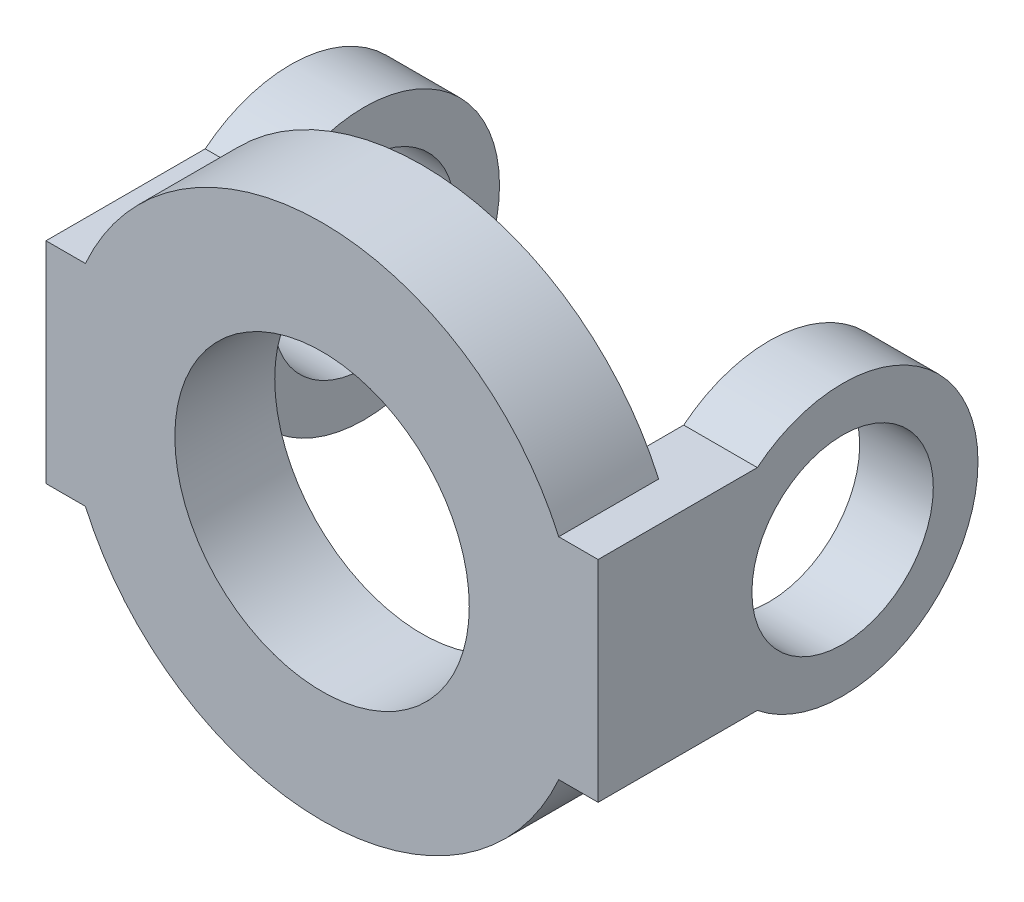
ISO-10303-21;
HEADER;
FILE_DESCRIPTION(('STEP AP214'),'2;1');
FILE_NAME('part.step','',(''),(''),'','','');
FILE_SCHEMA(('AUTOMOTIVE_DESIGN { 1 0 10303 214 1 1 1 1 }'));
ENDSEC;
DATA;
#1=APPLICATION_CONTEXT('core data for automotive mechanical design processes');
#2=APPLICATION_PROTOCOL_DEFINITION('international standard','automotive_design',2000,#1);
#3=PRODUCT_CONTEXT('',#1,'mechanical');
#4=PRODUCT('Part','Part','',(#3));
#5=PRODUCT_RELATED_PRODUCT_CATEGORY('part','',(#4));
#6=PRODUCT_DEFINITION_FORMATION('','',#4);
#7=PRODUCT_DEFINITION_CONTEXT('part definition',#1,'design');
#8=PRODUCT_DEFINITION('design','',#6,#7);
#9=PRODUCT_DEFINITION_SHAPE('','',#8);
#10=(LENGTH_UNIT() NAMED_UNIT(*) SI_UNIT(.MILLI.,.METRE.));
#11=(NAMED_UNIT(*) PLANE_ANGLE_UNIT() SI_UNIT($,.RADIAN.));
#12=(NAMED_UNIT(*) SI_UNIT($,.STERADIAN.) SOLID_ANGLE_UNIT());
#13=UNCERTAINTY_MEASURE_WITH_UNIT(LENGTH_MEASURE(1.E-05),#10,'distance_accuracy_value','');
#14=(GEOMETRIC_REPRESENTATION_CONTEXT(3) GLOBAL_UNCERTAINTY_ASSIGNED_CONTEXT((#13)) GLOBAL_UNIT_ASSIGNED_CONTEXT((#10,
#11,#12)) REPRESENTATION_CONTEXT('',''));
#15=CARTESIAN_POINT('',(0.,0.,0.));
#16=DIRECTION('',(0.,0.,1.));
#17=DIRECTION('',(1.,0.,0.));
#18=AXIS2_PLACEMENT_3D('',#15,#16,#17);
#19=CARTESIAN_POINT('',(0.,0.,0.));
#20=DIRECTION('',(0.,0.,1.));
#21=DIRECTION('',(1.,0.,0.));
#22=AXIS2_PLACEMENT_3D('',#19,#20,#21);
#23=PLANE('',#22);
#24=CARTESIAN_POINT('',(0.,0.,0.));
#25=DIRECTION('',(0.,0.,1.));
#26=DIRECTION('',(1.,0.,0.));
#27=AXIS2_PLACEMENT_3D('',#24,#25,#26);
#28=CIRCLE('',#27,56.);
#29=CARTESIAN_POINT('',(56.,0.,0.));
#30=VERTEX_POINT('',#29);
#31=EDGE_CURVE('E180',#30,#30,#28,.T.);
#32=ORIENTED_EDGE('',*,*,#31,.T.);
#33=EDGE_LOOP('',(#32));
#34=FACE_BOUND('',#33,.T.);
#35=DIRECTION('',(1.,0.,0.));
#36=VECTOR('',#35,1.);
#37=CARTESIAN_POINT('',(77.,-40.,0.));
#38=LINE('',#37,#36);
#39=CARTESIAN_POINT('',(77.,-40.,0.));
#40=VERTEX_POINT('',#39);
#41=CARTESIAN_POINT('',(90.012499132065,-40.,0.));
#42=VERTEX_POINT('',#41);
#43=EDGE_CURVE('E159',#40,#42,#38,.T.);
#44=ORIENTED_EDGE('',*,*,#43,.T.);
#45=CARTESIAN_POINT('',(0.,0.,0.));
#46=DIRECTION('',(0.,0.,1.));
#47=DIRECTION('',(1.,0.,0.));
#48=AXIS2_PLACEMENT_3D('',#45,#46,#47);
#49=CIRCLE('',#48,98.5);
#50=CARTESIAN_POINT('',(-90.012499132065,-40.,0.));
#51=VERTEX_POINT('',#50);
#52=EDGE_CURVE('E196',#51,#42,#49,.T.);
#53=ORIENTED_EDGE('',*,*,#52,.F.);
#54=DIRECTION('',(-1.,0.,0.));
#55=VECTOR('',#54,1.);
#56=CARTESIAN_POINT('',(-77.,-40.,0.));
#57=LINE('',#56,#55);
#58=CARTESIAN_POINT('',(-77.,-40.,0.));
#59=VERTEX_POINT('',#58);
#60=EDGE_CURVE('E183',#59,#51,#57,.T.);
#61=ORIENTED_EDGE('',*,*,#60,.F.);
#62=DIRECTION('',(0.,1.,0.));
#63=VECTOR('',#62,1.);
#64=CARTESIAN_POINT('',(-77.,-40.,0.));
#65=LINE('',#64,#63);
#66=CARTESIAN_POINT('',(-77.,40.,0.));
#67=VERTEX_POINT('',#66);
#68=EDGE_CURVE('E168',#59,#67,#65,.T.);
#69=ORIENTED_EDGE('',*,*,#68,.T.);
#70=DIRECTION('',(-1.,0.,0.));
#71=VECTOR('',#70,1.);
#72=CARTESIAN_POINT('',(-77.,40.,0.));
#73=LINE('',#72,#71);
#74=CARTESIAN_POINT('',(-90.012499132065,40.,0.));
#75=VERTEX_POINT('',#74);
#76=EDGE_CURVE('E181',#67,#75,#73,.T.);
#77=ORIENTED_EDGE('',*,*,#76,.T.);
#78=CARTESIAN_POINT('',(0.,0.,0.));
#79=DIRECTION('',(0.,0.,1.));
#80=DIRECTION('',(1.,0.,0.));
#81=AXIS2_PLACEMENT_3D('',#78,#79,#80);
#82=CIRCLE('',#81,98.5);
#83=CARTESIAN_POINT('',(90.012499132065,40.,0.));
#84=VERTEX_POINT('',#83);
#85=EDGE_CURVE('E190',#84,#75,#82,.T.);
#86=ORIENTED_EDGE('',*,*,#85,.F.);
#87=DIRECTION('',(1.,0.,0.));
#88=VECTOR('',#87,1.);
#89=CARTESIAN_POINT('',(77.,40.,0.));
#90=LINE('',#89,#88);
#91=CARTESIAN_POINT('',(77.,40.,0.));
#92=VERTEX_POINT('',#91);
#93=EDGE_CURVE('E142',#92,#84,#90,.T.);
#94=ORIENTED_EDGE('',*,*,#93,.F.);
#95=DIRECTION('',(0.,1.,0.));
#96=VECTOR('',#95,1.);
#97=CARTESIAN_POINT('',(77.,-40.,0.));
#98=LINE('',#97,#96);
#99=EDGE_CURVE('E131',#40,#92,#98,.T.);
#100=ORIENTED_EDGE('',*,*,#99,.F.);
#101=EDGE_LOOP('',(#44,#53,#61,#69,#77,#86,#94,#100));
#102=FACE_BOUND('',#101,.T.);
#103=ADVANCED_FACE('F34',(#34,#102),#23,.F.);
#104=CARTESIAN_POINT('',(0.,0.,38.));
#105=DIRECTION('',(0.,0.,1.));
#106=DIRECTION('',(1.,0.,0.));
#107=AXIS2_PLACEMENT_3D('',#104,#105,#106);
#108=PLANE('',#107);
#109=DIRECTION('',(-1.,0.,0.));
#110=VECTOR('',#109,1.);
#111=CARTESIAN_POINT('',(90.012499132065,40.,38.));
#112=LINE('',#111,#110);
#113=CARTESIAN_POINT('',(105.,40.,38.));
#114=VERTEX_POINT('',#113);
#115=CARTESIAN_POINT('',(90.012499132065,40.,38.));
#116=VERTEX_POINT('',#115);
#117=EDGE_CURVE('E193',#114,#116,#112,.T.);
#118=ORIENTED_EDGE('',*,*,#117,.T.);
#119=CARTESIAN_POINT('',(0.,0.,38.));
#120=DIRECTION('',(0.,0.,1.));
#121=DIRECTION('',(1.,0.,0.));
#122=AXIS2_PLACEMENT_3D('',#119,#120,#121);
#123=CIRCLE('',#122,98.5);
#124=CARTESIAN_POINT('',(-90.012499132065,40.,38.));
#125=VERTEX_POINT('',#124);
#126=EDGE_CURVE('E195',#116,#125,#123,.T.);
#127=ORIENTED_EDGE('',*,*,#126,.T.);
#128=DIRECTION('',(-1.,0.,0.));
#129=VECTOR('',#128,1.);
#130=CARTESIAN_POINT('',(-105.,40.,38.));
#131=LINE('',#130,#129);
#132=CARTESIAN_POINT('',(-105.,40.,38.));
#133=VERTEX_POINT('',#132);
#134=EDGE_CURVE('E198',#125,#133,#131,.T.);
#135=ORIENTED_EDGE('',*,*,#134,.T.);
#136=DIRECTION('',(0.,-1.,0.));
#137=VECTOR('',#136,1.);
#138=CARTESIAN_POINT('',(-105.,-40.,38.));
#139=LINE('',#138,#137);
#140=CARTESIAN_POINT('',(-105.,-40.,38.));
#141=VERTEX_POINT('',#140);
#142=EDGE_CURVE('E200',#133,#141,#139,.T.);
#143=ORIENTED_EDGE('',*,*,#142,.T.);
#144=DIRECTION('',(1.,0.,0.));
#145=VECTOR('',#144,1.);
#146=CARTESIAN_POINT('',(-105.,-40.,38.));
#147=LINE('',#146,#145);
#148=CARTESIAN_POINT('',(-90.012499132065,-40.,38.));
#149=VERTEX_POINT('',#148);
#150=EDGE_CURVE('E202',#141,#149,#147,.T.);
#151=ORIENTED_EDGE('',*,*,#150,.T.);
#152=CARTESIAN_POINT('',(0.,0.,38.));
#153=DIRECTION('',(0.,0.,1.));
#154=DIRECTION('',(1.,0.,0.));
#155=AXIS2_PLACEMENT_3D('',#152,#153,#154);
#156=CIRCLE('',#155,98.5);
#157=CARTESIAN_POINT('',(90.012499132065,-40.,38.));
#158=VERTEX_POINT('',#157);
#159=EDGE_CURVE('E204',#149,#158,#156,.T.);
#160=ORIENTED_EDGE('',*,*,#159,.T.);
#161=DIRECTION('',(1.,0.,0.));
#162=VECTOR('',#161,1.);
#163=CARTESIAN_POINT('',(90.012499132065,-40.,38.));
#164=LINE('',#163,#162);
#165=CARTESIAN_POINT('',(105.,-40.,38.));
#166=VERTEX_POINT('',#165);
#167=EDGE_CURVE('E55',#158,#166,#164,.T.);
#168=ORIENTED_EDGE('',*,*,#167,.T.);
#169=DIRECTION('',(0.,1.,0.));
#170=VECTOR('',#169,1.);
#171=CARTESIAN_POINT('',(105.,-40.,38.));
#172=LINE('',#171,#170);
#173=EDGE_CURVE('E50',#166,#114,#172,.T.);
#174=ORIENTED_EDGE('',*,*,#173,.T.);
#175=EDGE_LOOP('',(#118,#127,#135,#143,#151,#160,#168,#174));
#176=FACE_BOUND('',#175,.T.);
#177=CARTESIAN_POINT('',(0.,0.,38.));
#178=DIRECTION('',(0.,0.,1.));
#179=DIRECTION('',(1.,0.,0.));
#180=AXIS2_PLACEMENT_3D('',#177,#178,#179);
#181=CIRCLE('',#180,56.);
#182=CARTESIAN_POINT('',(56.,0.,38.));
#183=VERTEX_POINT('',#182);
#184=EDGE_CURVE('E187',#183,#183,#181,.T.);
#185=ORIENTED_EDGE('',*,*,#184,.F.);
#186=EDGE_LOOP('',(#185));
#187=FACE_BOUND('',#186,.T.);
#188=ADVANCED_FACE('F254',(#176,#187),#108,.T.);
#189=CARTESIAN_POINT('',(90.012499132065,40.,38.));
#190=DIRECTION('',(0.,-1.,0.));
#191=DIRECTION('',(1.,0.,0.));
#192=AXIS2_PLACEMENT_3D('',#189,#190,#191);
#193=PLANE('',#192);
#194=DIRECTION('',(0.,0.,-1.));
#195=VECTOR('',#194,1.);
#196=CARTESIAN_POINT('',(105.,40.,38.));
#197=LINE('',#196,#195);
#198=CARTESIAN_POINT('',(105.,40.,-22.5615968333828));
#199=VERTEX_POINT('',#198);
#200=EDGE_CURVE('E138',#114,#199,#197,.T.);
#201=ORIENTED_EDGE('',*,*,#200,.T.);
#202=DIRECTION('',(1.,0.,0.));
#203=VECTOR('',#202,1.);
#204=CARTESIAN_POINT('',(77.,40.,-22.5615968333828));
#205=LINE('',#204,#203);
#206=CARTESIAN_POINT('',(77.,40.,-22.5615968333828));
#207=VERTEX_POINT('',#206);
#208=EDGE_CURVE('E136',#207,#199,#205,.T.);
#209=ORIENTED_EDGE('',*,*,#208,.F.);
#210=DIRECTION('',(0.,0.,-1.));
#211=VECTOR('',#210,1.);
#212=CARTESIAN_POINT('',(77.,40.,0.));
#213=LINE('',#212,#211);
#214=EDGE_CURVE('E124',#92,#207,#213,.T.);
#215=ORIENTED_EDGE('',*,*,#214,.F.);
#216=ORIENTED_EDGE('',*,*,#93,.T.);
#217=DIRECTION('',(0.,0.,-1.));
#218=VECTOR('',#217,1.);
#219=CARTESIAN_POINT('',(90.012499132065,40.,38.));
#220=LINE('',#219,#218);
#221=EDGE_CURVE('E11',#116,#84,#220,.T.);
#222=ORIENTED_EDGE('',*,*,#221,.F.);
#223=ORIENTED_EDGE('',*,*,#117,.F.);
#224=EDGE_LOOP('',(#201,#209,#215,#216,#222,#223));
#225=FACE_BOUND('',#224,.T.);
#226=ADVANCED_FACE('F36',(#225),#193,.F.);
#227=CARTESIAN_POINT('',(0.,0.,38.));
#228=DIRECTION('',(0.,0.,-1.));
#229=DIRECTION('',(-1.,0.,0.));
#230=AXIS2_PLACEMENT_3D('',#227,#228,#229);
#231=CYLINDRICAL_SURFACE('',#230,98.5);
#232=ORIENTED_EDGE('',*,*,#85,.T.);
#233=DIRECTION('',(0.,0.,-1.));
#234=VECTOR('',#233,1.);
#235=CARTESIAN_POINT('',(-90.012499132065,40.,38.));
#236=LINE('',#235,#234);
#237=EDGE_CURVE('E43',#125,#75,#236,.T.);
#238=ORIENTED_EDGE('',*,*,#237,.F.);
#239=ORIENTED_EDGE('',*,*,#126,.F.);
#240=ORIENTED_EDGE('',*,*,#221,.T.);
#241=EDGE_LOOP('',(#232,#238,#239,#240));
#242=FACE_BOUND('',#241,.T.);
#243=ADVANCED_FACE('F233',(#242),#231,.T.);
#244=CARTESIAN_POINT('',(-105.,40.,38.));
#245=DIRECTION('',(0.,-1.,0.));
#246=DIRECTION('',(0.,0.,-1.));
#247=AXIS2_PLACEMENT_3D('',#244,#245,#246);
#248=PLANE('',#247);
#249=ORIENTED_EDGE('',*,*,#237,.T.);
#250=ORIENTED_EDGE('',*,*,#76,.F.);
#251=DIRECTION('',(0.,0.,-1.));
#252=VECTOR('',#251,1.);
#253=CARTESIAN_POINT('',(-77.,40.,0.));
#254=LINE('',#253,#252);
#255=CARTESIAN_POINT('',(-77.,40.,-22.5615968333828));
#256=VERTEX_POINT('',#255);
#257=EDGE_CURVE('E171',#67,#256,#254,.T.);
#258=ORIENTED_EDGE('',*,*,#257,.T.);
#259=DIRECTION('',(-1.,0.,0.));
#260=VECTOR('',#259,1.);
#261=CARTESIAN_POINT('',(-77.,40.,-22.5615968333828));
#262=LINE('',#261,#260);
#263=CARTESIAN_POINT('',(-105.,40.,-22.5615968333828));
#264=VERTEX_POINT('',#263);
#265=EDGE_CURVE('E177',#256,#264,#262,.T.);
#266=ORIENTED_EDGE('',*,*,#265,.T.);
#267=DIRECTION('',(0.,0.,-1.));
#268=VECTOR('',#267,1.);
#269=CARTESIAN_POINT('',(-105.,40.,38.));
#270=LINE('',#269,#268);
#271=EDGE_CURVE('E223',#133,#264,#270,.T.);
#272=ORIENTED_EDGE('',*,*,#271,.F.);
#273=ORIENTED_EDGE('',*,*,#134,.F.);
#274=EDGE_LOOP('',(#249,#250,#258,#266,#272,#273));
#275=FACE_BOUND('',#274,.T.);
#276=ADVANCED_FACE('F229',(#275),#248,.F.);
#277=CARTESIAN_POINT('',(-105.,-40.,38.));
#278=DIRECTION('',(1.,0.,0.));
#279=DIRECTION('',(0.,0.,-1.));
#280=AXIS2_PLACEMENT_3D('',#277,#278,#279);
#281=PLANE('',#280);
#282=CARTESIAN_POINT('',(-105.,0.,-55.));
#283=DIRECTION('',(-1.,0.,0.));
#284=DIRECTION('',(0.,0.,1.));
#285=AXIS2_PLACEMENT_3D('',#282,#283,#284);
#286=CIRCLE('',#285,34.5);
#287=CARTESIAN_POINT('',(-105.,0.,-20.5));
#288=VERTEX_POINT('',#287);
#289=EDGE_CURVE('E306',#288,#288,#286,.T.);
#290=ORIENTED_EDGE('',*,*,#289,.F.);
#291=EDGE_LOOP('',(#290));
#292=FACE_BOUND('',#291,.T.);
#293=ORIENTED_EDGE('',*,*,#271,.T.);
#294=CARTESIAN_POINT('',(-105.,0.,-55.));
#295=DIRECTION('',(-1.,0.,0.));
#296=DIRECTION('',(0.,0.,1.));
#297=AXIS2_PLACEMENT_3D('',#294,#295,#296);
#298=CIRCLE('',#297,51.5);
#299=CARTESIAN_POINT('',(-105.,-40.,-22.5615968333828));
#300=VERTEX_POINT('',#299);
#301=EDGE_CURVE('E158',#264,#300,#298,.T.);
#302=ORIENTED_EDGE('',*,*,#301,.T.);
#303=DIRECTION('',(0.,0.,-1.));
#304=VECTOR('',#303,1.);
#305=CARTESIAN_POINT('',(-105.,-40.,38.));
#306=LINE('',#305,#304);
#307=EDGE_CURVE('E221',#141,#300,#306,.T.);
#308=ORIENTED_EDGE('',*,*,#307,.F.);
#309=ORIENTED_EDGE('',*,*,#142,.F.);
#310=EDGE_LOOP('',(#293,#302,#308,#309));
#311=FACE_BOUND('',#310,.T.);
#312=ADVANCED_FACE('F252',(#292,#311),#281,.F.);
#313=CARTESIAN_POINT('',(-105.,-40.,38.));
#314=DIRECTION('',(0.,1.,0.));
#315=DIRECTION('',(0.,0.,1.));
#316=AXIS2_PLACEMENT_3D('',#313,#314,#315);
#317=PLANE('',#316);
#318=ORIENTED_EDGE('',*,*,#307,.T.);
#319=DIRECTION('',(-1.,0.,0.));
#320=VECTOR('',#319,1.);
#321=CARTESIAN_POINT('',(-77.,-40.,-22.5615968333828));
#322=LINE('',#321,#320);
#323=CARTESIAN_POINT('',(-77.,-40.,-22.5615968333828));
#324=VERTEX_POINT('',#323);
#325=EDGE_CURVE('E174',#324,#300,#322,.T.);
#326=ORIENTED_EDGE('',*,*,#325,.F.);
#327=DIRECTION('',(0.,0.,1.));
#328=VECTOR('',#327,1.);
#329=CARTESIAN_POINT('',(-77.,-40.,-22.5615968333828));
#330=LINE('',#329,#328);
#331=EDGE_CURVE('E165',#324,#59,#330,.T.);
#332=ORIENTED_EDGE('',*,*,#331,.T.);
#333=ORIENTED_EDGE('',*,*,#60,.T.);
#334=DIRECTION('',(0.,0.,-1.));
#335=VECTOR('',#334,1.);
#336=CARTESIAN_POINT('',(-90.012499132065,-40.,38.));
#337=LINE('',#336,#335);
#338=EDGE_CURVE('E218',#149,#51,#337,.T.);
#339=ORIENTED_EDGE('',*,*,#338,.F.);
#340=ORIENTED_EDGE('',*,*,#150,.F.);
#341=EDGE_LOOP('',(#318,#326,#332,#333,#339,#340));
#342=FACE_BOUND('',#341,.T.);
#343=ADVANCED_FACE('F244',(#342),#317,.F.);
#344=CARTESIAN_POINT('',(0.,0.,38.));
#345=DIRECTION('',(0.,0.,-1.));
#346=DIRECTION('',(-1.,0.,0.));
#347=AXIS2_PLACEMENT_3D('',#344,#345,#346);
#348=CYLINDRICAL_SURFACE('',#347,98.5);
#349=ORIENTED_EDGE('',*,*,#52,.T.);
#350=DIRECTION('',(0.,0.,-1.));
#351=VECTOR('',#350,1.);
#352=CARTESIAN_POINT('',(90.012499132065,-40.,38.));
#353=LINE('',#352,#351);
#354=EDGE_CURVE('E215',#158,#42,#353,.T.);
#355=ORIENTED_EDGE('',*,*,#354,.F.);
#356=ORIENTED_EDGE('',*,*,#159,.F.);
#357=ORIENTED_EDGE('',*,*,#338,.T.);
#358=EDGE_LOOP('',(#349,#355,#356,#357));
#359=FACE_BOUND('',#358,.T.);
#360=ADVANCED_FACE('F259',(#359),#348,.T.);
#361=CARTESIAN_POINT('',(90.012499132065,-40.,38.));
#362=DIRECTION('',(0.,1.,0.));
#363=DIRECTION('',(0.,0.,1.));
#364=AXIS2_PLACEMENT_3D('',#361,#362,#363);
#365=PLANE('',#364);
#366=ORIENTED_EDGE('',*,*,#354,.T.);
#367=ORIENTED_EDGE('',*,*,#43,.F.);
#368=DIRECTION('',(0.,0.,1.));
#369=VECTOR('',#368,1.);
#370=CARTESIAN_POINT('',(77.,-40.,-22.5615968333828));
#371=LINE('',#370,#369);
#372=CARTESIAN_POINT('',(77.,-40.,-22.5615968333828));
#373=VERTEX_POINT('',#372);
#374=EDGE_CURVE('E143',#373,#40,#371,.T.);
#375=ORIENTED_EDGE('',*,*,#374,.F.);
#376=DIRECTION('',(1.,0.,0.));
#377=VECTOR('',#376,1.);
#378=CARTESIAN_POINT('',(77.,-40.,-22.5615968333828));
#379=LINE('',#378,#377);
#380=CARTESIAN_POINT('',(105.,-40.,-22.5615968333828));
#381=VERTEX_POINT('',#380);
#382=EDGE_CURVE('E147',#373,#381,#379,.T.);
#383=ORIENTED_EDGE('',*,*,#382,.T.);
#384=DIRECTION('',(0.,0.,-1.));
#385=VECTOR('',#384,1.);
#386=CARTESIAN_POINT('',(105.,-40.,38.));
#387=LINE('',#386,#385);
#388=EDGE_CURVE('E213',#166,#381,#387,.T.);
#389=ORIENTED_EDGE('',*,*,#388,.F.);
#390=ORIENTED_EDGE('',*,*,#167,.F.);
#391=EDGE_LOOP('',(#366,#367,#375,#383,#389,#390));
#392=FACE_BOUND('',#391,.T.);
#393=ADVANCED_FACE('F262',(#392),#365,.F.);
#394=CARTESIAN_POINT('',(105.,-40.,38.));
#395=DIRECTION('',(-1.,0.,0.));
#396=DIRECTION('',(0.,0.,1.));
#397=AXIS2_PLACEMENT_3D('',#394,#395,#396);
#398=PLANE('',#397);
#399=CARTESIAN_POINT('',(105.,0.,-55.));
#400=DIRECTION('',(-1.,0.,0.));
#401=DIRECTION('',(0.,0.,1.));
#402=AXIS2_PLACEMENT_3D('',#399,#400,#401);
#403=CIRCLE('',#402,34.5);
#404=CARTESIAN_POINT('',(105.,0.,-20.5));
#405=VERTEX_POINT('',#404);
#406=EDGE_CURVE('E310',#405,#405,#403,.T.);
#407=ORIENTED_EDGE('',*,*,#406,.T.);
#408=EDGE_LOOP('',(#407));
#409=FACE_BOUND('',#408,.T.);
#410=ORIENTED_EDGE('',*,*,#388,.T.);
#411=CARTESIAN_POINT('',(105.,0.,-55.));
#412=DIRECTION('',(-1.,0.,0.));
#413=DIRECTION('',(0.,0.,1.));
#414=AXIS2_PLACEMENT_3D('',#411,#412,#413);
#415=CIRCLE('',#414,51.5);
#416=EDGE_CURVE('E148',#199,#381,#415,.T.);
#417=ORIENTED_EDGE('',*,*,#416,.F.);
#418=ORIENTED_EDGE('',*,*,#200,.F.);
#419=ORIENTED_EDGE('',*,*,#173,.F.);
#420=EDGE_LOOP('',(#410,#417,#418,#419));
#421=FACE_BOUND('',#420,.T.);
#422=ADVANCED_FACE('F264',(#409,#421),#398,.F.);
#423=CARTESIAN_POINT('',(0.,0.,38.));
#424=DIRECTION('',(0.,0.,-1.));
#425=DIRECTION('',(-1.,0.,0.));
#426=AXIS2_PLACEMENT_3D('',#423,#424,#425);
#427=CYLINDRICAL_SURFACE('',#426,56.);
#428=ORIENTED_EDGE('',*,*,#184,.T.);
#429=EDGE_LOOP('',(#428));
#430=FACE_BOUND('',#429,.T.);
#431=ORIENTED_EDGE('',*,*,#31,.F.);
#432=EDGE_LOOP('',(#431));
#433=FACE_BOUND('',#432,.T.);
#434=ADVANCED_FACE('F266',(#430,#433),#427,.F.);
#435=CARTESIAN_POINT('',(-77.,0.,-55.));
#436=DIRECTION('',(-1.,0.,0.));
#437=DIRECTION('',(0.,0.,1.));
#438=AXIS2_PLACEMENT_3D('',#435,#436,#437);
#439=CYLINDRICAL_SURFACE('',#438,51.5);
#440=ORIENTED_EDGE('',*,*,#301,.F.);
#441=ORIENTED_EDGE('',*,*,#265,.F.);
#442=CARTESIAN_POINT('',(-77.,0.,-55.));
#443=DIRECTION('',(-1.,0.,0.));
#444=DIRECTION('',(0.,0.,1.));
#445=AXIS2_PLACEMENT_3D('',#442,#443,#444);
#446=CIRCLE('',#445,51.5);
#447=EDGE_CURVE('E162',#256,#324,#446,.T.);
#448=ORIENTED_EDGE('',*,*,#447,.T.);
#449=ORIENTED_EDGE('',*,*,#325,.T.);
#450=EDGE_LOOP('',(#440,#441,#448,#449));
#451=FACE_BOUND('',#450,.T.);
#452=ADVANCED_FACE('F250',(#451),#439,.T.);
#453=CARTESIAN_POINT('',(-77.,0.,-55.));
#454=DIRECTION('',(-1.,0.,0.));
#455=DIRECTION('',(0.,0.,1.));
#456=AXIS2_PLACEMENT_3D('',#453,#454,#455);
#457=PLANE('',#456);
#458=CARTESIAN_POINT('',(-77.,0.,-55.));
#459=DIRECTION('',(-1.,0.,0.));
#460=DIRECTION('',(0.,0.,1.));
#461=AXIS2_PLACEMENT_3D('',#458,#459,#460);
#462=CIRCLE('',#461,34.5);
#463=CARTESIAN_POINT('',(-77.,0.,-20.5));
#464=VERTEX_POINT('',#463);
#465=EDGE_CURVE('E150',#464,#464,#462,.T.);
#466=ORIENTED_EDGE('',*,*,#465,.T.);
#467=EDGE_LOOP('',(#466));
#468=FACE_BOUND('',#467,.T.);
#469=ORIENTED_EDGE('',*,*,#447,.F.);
#470=ORIENTED_EDGE('',*,*,#257,.F.);
#471=ORIENTED_EDGE('',*,*,#68,.F.);
#472=ORIENTED_EDGE('',*,*,#331,.F.);
#473=EDGE_LOOP('',(#469,#470,#471,#472));
#474=FACE_BOUND('',#473,.T.);
#475=ADVANCED_FACE('F242',(#468,#474),#457,.F.);
#476=CARTESIAN_POINT('',(77.,0.,-55.));
#477=DIRECTION('',(1.,0.,0.));
#478=DIRECTION('',(0.,0.,-1.));
#479=AXIS2_PLACEMENT_3D('',#476,#477,#478);
#480=CYLINDRICAL_SURFACE('',#479,51.5);
#481=ORIENTED_EDGE('',*,*,#416,.T.);
#482=ORIENTED_EDGE('',*,*,#382,.F.);
#483=CARTESIAN_POINT('',(77.,0.,-55.));
#484=DIRECTION('',(-1.,0.,0.));
#485=DIRECTION('',(0.,0.,1.));
#486=AXIS2_PLACEMENT_3D('',#483,#484,#485);
#487=CIRCLE('',#486,51.5);
#488=EDGE_CURVE('E128',#207,#373,#487,.T.);
#489=ORIENTED_EDGE('',*,*,#488,.F.);
#490=ORIENTED_EDGE('',*,*,#208,.T.);
#491=EDGE_LOOP('',(#481,#482,#489,#490));
#492=FACE_BOUND('',#491,.T.);
#493=ADVANCED_FACE('F145',(#492),#480,.T.);
#494=CARTESIAN_POINT('',(77.,0.,-55.));
#495=DIRECTION('',(1.,0.,0.));
#496=DIRECTION('',(0.,0.,1.));
#497=AXIS2_PLACEMENT_3D('',#494,#495,#496);
#498=PLANE('',#497);
#499=CARTESIAN_POINT('',(77.,0.,-55.));
#500=DIRECTION('',(1.,0.,0.));
#501=DIRECTION('',(0.,0.,-1.));
#502=AXIS2_PLACEMENT_3D('',#499,#500,#501);
#503=CIRCLE('',#502,34.5);
#504=CARTESIAN_POINT('',(77.,0.,-89.5));
#505=VERTEX_POINT('',#504);
#506=EDGE_CURVE('E38',#505,#505,#503,.T.);
#507=ORIENTED_EDGE('',*,*,#506,.T.);
#508=EDGE_LOOP('',(#507));
#509=FACE_BOUND('',#508,.T.);
#510=ORIENTED_EDGE('',*,*,#488,.T.);
#511=ORIENTED_EDGE('',*,*,#374,.T.);
#512=ORIENTED_EDGE('',*,*,#99,.T.);
#513=ORIENTED_EDGE('',*,*,#214,.T.);
#514=EDGE_LOOP('',(#510,#511,#512,#513));
#515=FACE_BOUND('',#514,.T.);
#516=ADVANCED_FACE('F126',(#509,#515),#498,.F.);
#517=CARTESIAN_POINT('',(105.,0.,-55.));
#518=DIRECTION('',(-1.,0.,0.));
#519=DIRECTION('',(0.,0.,1.));
#520=AXIS2_PLACEMENT_3D('',#517,#518,#519);
#521=CYLINDRICAL_SURFACE('',#520,34.5);
#522=ORIENTED_EDGE('',*,*,#406,.F.);
#523=EDGE_LOOP('',(#522));
#524=FACE_BOUND('',#523,.T.);
#525=ORIENTED_EDGE('',*,*,#506,.F.);
#526=EDGE_LOOP('',(#525));
#527=FACE_BOUND('',#526,.T.);
#528=ADVANCED_FACE('F294',(#524,#527),#521,.F.);
#529=ORIENTED_EDGE('',*,*,#289,.T.);
#530=EDGE_LOOP('',(#529));
#531=FACE_BOUND('',#530,.T.);
#532=ORIENTED_EDGE('',*,*,#465,.F.);
#533=EDGE_LOOP('',(#532));
#534=FACE_BOUND('',#533,.T.);
#535=ADVANCED_FACE('F296',(#531,#534),#521,.F.);
#536=CLOSED_SHELL('',(#103,#188,#226,#243,#276,#312,#343,#360,#393,#422,#434,#452,#475,#493,
#516,#528,#535));
#537=MANIFOLD_SOLID_BREP('B2',#536);
#538=ADVANCED_BREP_SHAPE_REPRESENTATION('',(#18,#537),#14);
#539=SHAPE_DEFINITION_REPRESENTATION(#9,#538);
ENDSEC;
END-ISO-10303-21;
